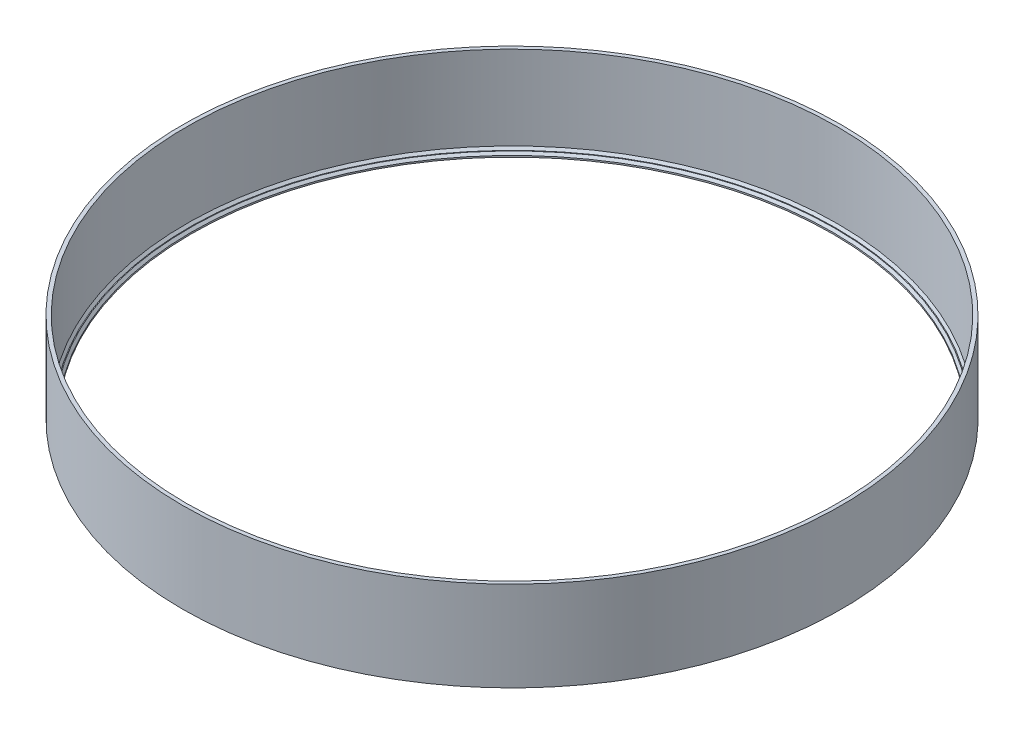
ISO-10303-21;
HEADER;
FILE_DESCRIPTION(('STEP AP214'),'2;1');
FILE_NAME('part.step','',(''),(''),'','','');
FILE_SCHEMA(('AUTOMOTIVE_DESIGN { 1 0 10303 214 1 1 1 1 }'));
ENDSEC;
DATA;
#1=APPLICATION_CONTEXT('core data for automotive mechanical design processes');
#2=APPLICATION_PROTOCOL_DEFINITION('international standard','automotive_design',2000,#1);
#3=PRODUCT_CONTEXT('',#1,'mechanical');
#4=PRODUCT('Part','Part','',(#3));
#5=PRODUCT_RELATED_PRODUCT_CATEGORY('part','',(#4));
#6=PRODUCT_DEFINITION_FORMATION('','',#4);
#7=PRODUCT_DEFINITION_CONTEXT('part definition',#1,'design');
#8=PRODUCT_DEFINITION('design','',#6,#7);
#9=PRODUCT_DEFINITION_SHAPE('','',#8);
#10=(LENGTH_UNIT() NAMED_UNIT(*) SI_UNIT(.MILLI.,.METRE.));
#11=(NAMED_UNIT(*) PLANE_ANGLE_UNIT() SI_UNIT($,.RADIAN.));
#12=(NAMED_UNIT(*) SI_UNIT($,.STERADIAN.) SOLID_ANGLE_UNIT());
#13=UNCERTAINTY_MEASURE_WITH_UNIT(LENGTH_MEASURE(1.E-05),#10,'distance_accuracy_value','');
#14=(GEOMETRIC_REPRESENTATION_CONTEXT(3) GLOBAL_UNCERTAINTY_ASSIGNED_CONTEXT((#13)) GLOBAL_UNIT_ASSIGNED_CONTEXT((#10,
#11,#12)) REPRESENTATION_CONTEXT('',''));
#15=CARTESIAN_POINT('',(0.,0.,0.));
#16=DIRECTION('',(0.,0.,1.));
#17=DIRECTION('',(1.,0.,0.));
#18=AXIS2_PLACEMENT_3D('',#15,#16,#17);
#19=CARTESIAN_POINT('',(0.,12.,0.));
#20=DIRECTION('',(0.,-1.,0.));
#21=DIRECTION('',(0.,0.,-1.));
#22=AXIS2_PLACEMENT_3D('',#19,#20,#21);
#23=CYLINDRICAL_SURFACE('',#22,43.5);
#24=CARTESIAN_POINT('',(0.,0.800000000000002,0.));
#25=DIRECTION('',(0.,-1.,0.));
#26=DIRECTION('',(0.,0.,-1.));
#27=AXIS2_PLACEMENT_3D('',#24,#25,#26);
#28=CIRCLE('',#27,43.5);
#29=CARTESIAN_POINT('',(0.,0.800000000000002,-43.5));
#30=VERTEX_POINT('',#29);
#31=EDGE_CURVE('E10',#30,#30,#28,.T.);
#32=ORIENTED_EDGE('',*,*,#31,.T.);
#33=EDGE_LOOP('',(#32));
#34=FACE_BOUND('',#33,.T.);
#35=CARTESIAN_POINT('',(0.,12.,0.));
#36=DIRECTION('',(0.,1.,0.));
#37=DIRECTION('',(0.,0.,1.));
#38=AXIS2_PLACEMENT_3D('',#35,#36,#37);
#39=CIRCLE('',#38,43.5);
#40=CARTESIAN_POINT('',(0.,12.,43.5));
#41=VERTEX_POINT('',#40);
#42=EDGE_CURVE('E66',#41,#41,#39,.T.);
#43=ORIENTED_EDGE('',*,*,#42,.T.);
#44=EDGE_LOOP('',(#43));
#45=FACE_BOUND('',#44,.T.);
#46=ADVANCED_FACE('F37',(#34,#45),#23,.F.);
#47=CARTESIAN_POINT('',(0.,12.,0.));
#48=DIRECTION('',(0.,1.,0.));
#49=DIRECTION('',(0.,0.,1.));
#50=AXIS2_PLACEMENT_3D('',#47,#48,#49);
#51=PLANE('',#50);
#52=CARTESIAN_POINT('',(0.,12.,0.));
#53=DIRECTION('',(0.,1.,0.));
#54=DIRECTION('',(0.,0.,1.));
#55=AXIS2_PLACEMENT_3D('',#52,#53,#54);
#56=CIRCLE('',#55,44.);
#57=CARTESIAN_POINT('',(0.,12.,44.));
#58=VERTEX_POINT('',#57);
#59=EDGE_CURVE('E61',#58,#58,#56,.T.);
#60=ORIENTED_EDGE('',*,*,#59,.T.);
#61=EDGE_LOOP('',(#60));
#62=FACE_BOUND('',#61,.T.);
#63=ORIENTED_EDGE('',*,*,#42,.F.);
#64=EDGE_LOOP('',(#63));
#65=FACE_BOUND('',#64,.T.);
#66=ADVANCED_FACE('F83',(#62,#65),#51,.T.);
#67=CARTESIAN_POINT('',(0.,0.,0.));
#68=DIRECTION('',(0.,1.,0.));
#69=DIRECTION('',(0.,0.,1.));
#70=AXIS2_PLACEMENT_3D('',#67,#68,#69);
#71=PLANE('',#70);
#72=CARTESIAN_POINT('',(0.,0.,0.));
#73=DIRECTION('',(0.,1.,0.));
#74=DIRECTION('',(0.,0.,1.));
#75=AXIS2_PLACEMENT_3D('',#72,#73,#74);
#76=CIRCLE('',#75,44.);
#77=CARTESIAN_POINT('',(0.,0.,44.));
#78=VERTEX_POINT('',#77);
#79=EDGE_CURVE('E62',#78,#78,#76,.T.);
#80=ORIENTED_EDGE('',*,*,#79,.F.);
#81=EDGE_LOOP('',(#80));
#82=FACE_BOUND('',#81,.T.);
#83=CARTESIAN_POINT('',(0.,0.,0.));
#84=DIRECTION('',(0.,-1.,0.));
#85=DIRECTION('',(0.,0.,-1.));
#86=AXIS2_PLACEMENT_3D('',#83,#84,#85);
#87=CIRCLE('',#86,42.8);
#88=CARTESIAN_POINT('',(0.,0.,-42.8));
#89=VERTEX_POINT('',#88);
#90=EDGE_CURVE('E73',#89,#89,#87,.T.);
#91=ORIENTED_EDGE('',*,*,#90,.F.);
#92=EDGE_LOOP('',(#91));
#93=FACE_BOUND('',#92,.T.);
#94=ADVANCED_FACE('F80',(#82,#93),#71,.F.);
#95=CARTESIAN_POINT('',(0.,12.,0.));
#96=DIRECTION('',(0.,-1.,0.));
#97=DIRECTION('',(0.,0.,-1.));
#98=AXIS2_PLACEMENT_3D('',#95,#96,#97);
#99=CYLINDRICAL_SURFACE('',#98,44.);
#100=ORIENTED_EDGE('',*,*,#79,.T.);
#101=EDGE_LOOP('',(#100));
#102=FACE_BOUND('',#101,.T.);
#103=ORIENTED_EDGE('',*,*,#59,.F.);
#104=EDGE_LOOP('',(#103));
#105=FACE_BOUND('',#104,.T.);
#106=ADVANCED_FACE('F82',(#102,#105),#99,.T.);
#107=CARTESIAN_POINT('',(0.,0.5,0.));
#108=DIRECTION('',(0.,-1.,0.));
#109=DIRECTION('',(0.,0.,-1.));
#110=AXIS2_PLACEMENT_3D('',#107,#108,#109);
#111=PLANE('',#110);
#112=CARTESIAN_POINT('',(0.,0.5,0.));
#113=DIRECTION('',(0.,-1.,0.));
#114=DIRECTION('',(0.,0.,-1.));
#115=AXIS2_PLACEMENT_3D('',#112,#113,#114);
#116=CIRCLE('',#115,43.1);
#117=CARTESIAN_POINT('',(0.,0.5,-43.1));
#118=VERTEX_POINT('',#117);
#119=EDGE_CURVE('E50',#118,#118,#116,.T.);
#120=ORIENTED_EDGE('',*,*,#119,.T.);
#121=EDGE_LOOP('',(#120));
#122=FACE_BOUND('',#121,.T.);
#123=CARTESIAN_POINT('',(0.,0.5,0.));
#124=DIRECTION('',(0.,-1.,0.));
#125=DIRECTION('',(0.,0.,-1.));
#126=AXIS2_PLACEMENT_3D('',#123,#124,#125);
#127=CIRCLE('',#126,43.2);
#128=CARTESIAN_POINT('',(0.,0.5,-43.2));
#129=VERTEX_POINT('',#128);
#130=EDGE_CURVE('E55',#129,#129,#127,.F.);
#131=ORIENTED_EDGE('',*,*,#130,.T.);
#132=EDGE_LOOP('',(#131));
#133=FACE_BOUND('',#132,.T.);
#134=ADVANCED_FACE('F90',(#122,#133),#111,.F.);
#135=CARTESIAN_POINT('',(0.,0.5,0.));
#136=DIRECTION('',(0.,-1.,0.));
#137=DIRECTION('',(0.,0.,-1.));
#138=AXIS2_PLACEMENT_3D('',#135,#136,#137);
#139=CYLINDRICAL_SURFACE('',#138,42.8);
#140=CARTESIAN_POINT('',(0.,0.199999999999991,0.));
#141=DIRECTION('',(0.,-1.,0.));
#142=DIRECTION('',(0.,0.,-1.));
#143=AXIS2_PLACEMENT_3D('',#140,#141,#142);
#144=CIRCLE('',#143,42.8);
#145=CARTESIAN_POINT('',(0.,0.199999999999991,-42.8));
#146=VERTEX_POINT('',#145);
#147=EDGE_CURVE('E45',#146,#146,#144,.F.);
#148=ORIENTED_EDGE('',*,*,#147,.T.);
#149=EDGE_LOOP('',(#148));
#150=FACE_BOUND('',#149,.T.);
#151=ORIENTED_EDGE('',*,*,#90,.T.);
#152=EDGE_LOOP('',(#151));
#153=FACE_BOUND('',#152,.T.);
#154=ADVANCED_FACE('F78',(#150,#153),#139,.F.);
#155=CARTESIAN_POINT('',(0.,0.5,0.));
#156=DIRECTION('',(0.,1.,0.));
#157=DIRECTION('',(0.,0.,1.));
#158=AXIS2_PLACEMENT_3D('',#155,#156,#157);
#159=CONICAL_SURFACE('',#158,43.1,0.785398163397448);
#160=ORIENTED_EDGE('',*,*,#147,.F.);
#161=EDGE_LOOP('',(#160));
#162=FACE_BOUND('',#161,.T.);
#163=ORIENTED_EDGE('',*,*,#119,.F.);
#164=EDGE_LOOP('',(#163));
#165=FACE_BOUND('',#164,.T.);
#166=ADVANCED_FACE('F106',(#162,#165),#159,.F.);
#167=CARTESIAN_POINT('',(0.,0.800000000000002,0.));
#168=DIRECTION('',(0.,1.,0.));
#169=DIRECTION('',(0.,0.,1.));
#170=AXIS2_PLACEMENT_3D('',#167,#168,#169);
#171=CONICAL_SURFACE('',#170,43.5,0.785398163397448);
#172=ORIENTED_EDGE('',*,*,#130,.F.);
#173=EDGE_LOOP('',(#172));
#174=FACE_BOUND('',#173,.T.);
#175=ORIENTED_EDGE('',*,*,#31,.F.);
#176=EDGE_LOOP('',(#175));
#177=FACE_BOUND('',#176,.T.);
#178=ADVANCED_FACE('F39',(#174,#177),#171,.F.);
#179=CLOSED_SHELL('',(#46,#66,#94,#106,#134,#154,#166,#178));
#180=MANIFOLD_SOLID_BREP('B2',#179);
#181=ADVANCED_BREP_SHAPE_REPRESENTATION('',(#18,#180),#14);
#182=SHAPE_DEFINITION_REPRESENTATION(#9,#181);
ENDSEC;
END-ISO-10303-21;
